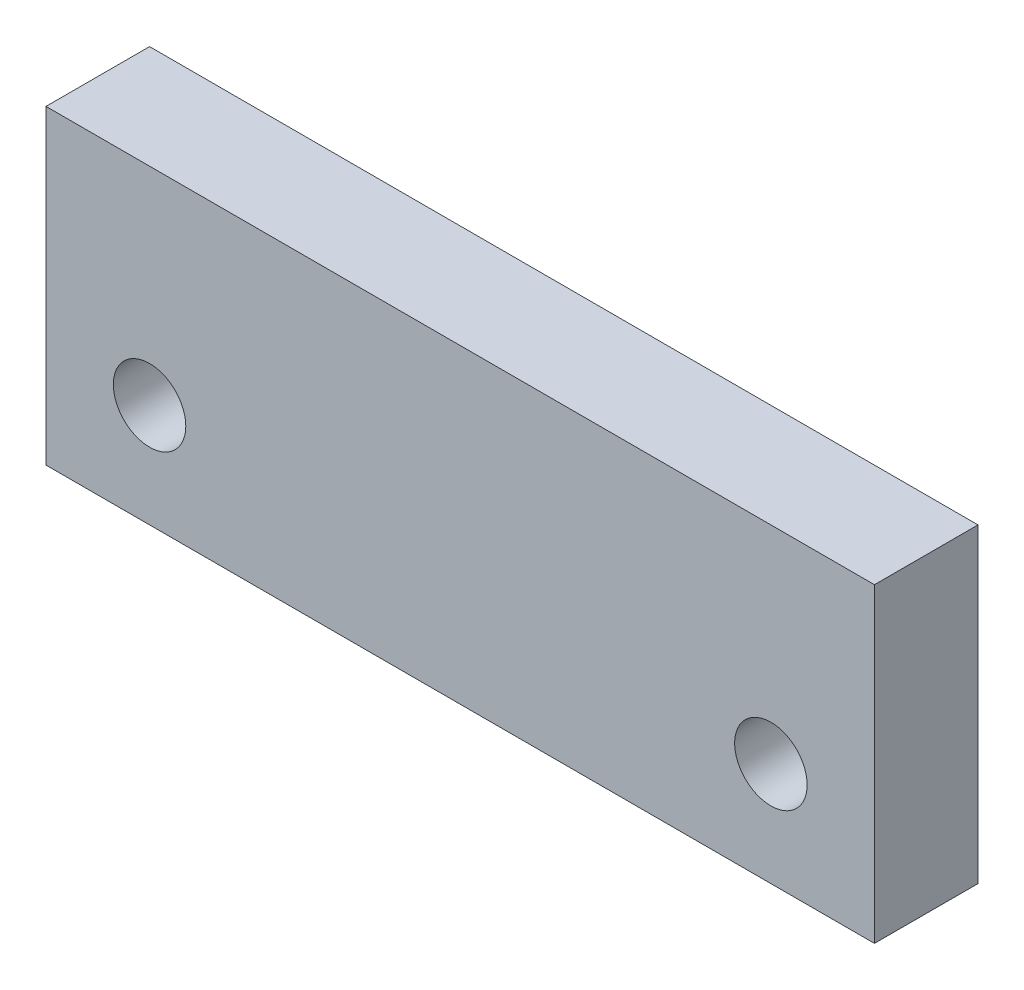
ISO-10303-21;
HEADER;
FILE_DESCRIPTION(('STEP AP214'),'2;1');
FILE_NAME('part.step','',(''),(''),'','','');
FILE_SCHEMA(('AUTOMOTIVE_DESIGN { 1 0 10303 214 1 1 1 1 }'));
ENDSEC;
DATA;
#1=APPLICATION_CONTEXT('core data for automotive mechanical design processes');
#2=APPLICATION_PROTOCOL_DEFINITION('international standard','automotive_design',2000,#1);
#3=PRODUCT_CONTEXT('',#1,'mechanical');
#4=PRODUCT('Part','Part','',(#3));
#5=PRODUCT_RELATED_PRODUCT_CATEGORY('part','',(#4));
#6=PRODUCT_DEFINITION_FORMATION('','',#4);
#7=PRODUCT_DEFINITION_CONTEXT('part definition',#1,'design');
#8=PRODUCT_DEFINITION('design','',#6,#7);
#9=PRODUCT_DEFINITION_SHAPE('','',#8);
#10=(LENGTH_UNIT() NAMED_UNIT(*) SI_UNIT(.MILLI.,.METRE.));
#11=(NAMED_UNIT(*) PLANE_ANGLE_UNIT() SI_UNIT($,.RADIAN.));
#12=(NAMED_UNIT(*) SI_UNIT($,.STERADIAN.) SOLID_ANGLE_UNIT());
#13=UNCERTAINTY_MEASURE_WITH_UNIT(LENGTH_MEASURE(1.E-05),#10,'distance_accuracy_value','');
#14=(GEOMETRIC_REPRESENTATION_CONTEXT(3) GLOBAL_UNCERTAINTY_ASSIGNED_CONTEXT((#13)) GLOBAL_UNIT_ASSIGNED_CONTEXT((#10,
#11,#12)) REPRESENTATION_CONTEXT('',''));
#15=CARTESIAN_POINT('',(0.,0.,0.));
#16=DIRECTION('',(0.,0.,1.));
#17=DIRECTION('',(1.,0.,0.));
#18=AXIS2_PLACEMENT_3D('',#15,#16,#17);
#19=CARTESIAN_POINT('',(0.,0.,5.));
#20=DIRECTION('',(0.,0.,-1.));
#21=DIRECTION('',(-1.,0.,0.));
#22=AXIS2_PLACEMENT_3D('',#19,#20,#21);
#23=PLANE('',#22);
#24=DIRECTION('',(0.,1.,0.));
#25=VECTOR('',#24,1.);
#26=CARTESIAN_POINT('',(20.,-7.5,5.));
#27=LINE('',#26,#25);
#28=CARTESIAN_POINT('',(20.,-7.5,5.));
#29=VERTEX_POINT('',#28);
#30=CARTESIAN_POINT('',(20.,7.5,5.));
#31=VERTEX_POINT('',#30);
#32=EDGE_CURVE('E93',#29,#31,#27,.T.);
#33=ORIENTED_EDGE('',*,*,#32,.T.);
#34=DIRECTION('',(-1.,0.,0.));
#35=VECTOR('',#34,1.);
#36=CARTESIAN_POINT('',(-20.,7.5,5.));
#37=LINE('',#36,#35);
#38=CARTESIAN_POINT('',(-20.,7.5,5.));
#39=VERTEX_POINT('',#38);
#40=EDGE_CURVE('E88',#31,#39,#37,.T.);
#41=ORIENTED_EDGE('',*,*,#40,.T.);
#42=DIRECTION('',(0.,-1.,0.));
#43=VECTOR('',#42,1.);
#44=CARTESIAN_POINT('',(-20.,-7.5,5.));
#45=LINE('',#44,#43);
#46=CARTESIAN_POINT('',(-20.,-7.5,5.));
#47=VERTEX_POINT('',#46);
#48=EDGE_CURVE('E91',#39,#47,#45,.T.);
#49=ORIENTED_EDGE('',*,*,#48,.T.);
#50=DIRECTION('',(1.,0.,0.));
#51=VECTOR('',#50,1.);
#52=CARTESIAN_POINT('',(-20.,-7.5,5.));
#53=LINE('',#52,#51);
#54=EDGE_CURVE('E58',#47,#29,#53,.T.);
#55=ORIENTED_EDGE('',*,*,#54,.T.);
#56=EDGE_LOOP('',(#33,#41,#49,#55));
#57=FACE_BOUND('',#56,.T.);
#58=CARTESIAN_POINT('',(-15.,-2.5,5.));
#59=DIRECTION('',(0.,0.,1.));
#60=DIRECTION('',(1.,0.,0.));
#61=AXIS2_PLACEMENT_3D('',#58,#59,#60);
#62=CIRCLE('',#61,1.75);
#63=CARTESIAN_POINT('',(-13.25,-2.5,5.));
#64=VERTEX_POINT('',#63);
#65=EDGE_CURVE('E108',#64,#64,#62,.T.);
#66=ORIENTED_EDGE('',*,*,#65,.F.);
#67=EDGE_LOOP('',(#66));
#68=FACE_BOUND('',#67,.T.);
#69=CARTESIAN_POINT('',(15.,-2.5,5.));
#70=DIRECTION('',(0.,0.,1.));
#71=DIRECTION('',(1.,0.,0.));
#72=AXIS2_PLACEMENT_3D('',#69,#70,#71);
#73=CIRCLE('',#72,1.75);
#74=CARTESIAN_POINT('',(16.75,-2.5,5.));
#75=VERTEX_POINT('',#74);
#76=EDGE_CURVE('E123',#75,#75,#73,.T.);
#77=ORIENTED_EDGE('',*,*,#76,.F.);
#78=EDGE_LOOP('',(#77));
#79=FACE_BOUND('',#78,.T.);
#80=ADVANCED_FACE('F41',(#57,#68,#79),#23,.F.);
#81=CARTESIAN_POINT('',(0.,0.,0.));
#82=DIRECTION('',(0.,0.,-1.));
#83=DIRECTION('',(-1.,0.,0.));
#84=AXIS2_PLACEMENT_3D('',#81,#82,#83);
#85=PLANE('',#84);
#86=CARTESIAN_POINT('',(-15.,-2.5,0.));
#87=DIRECTION('',(0.,0.,1.));
#88=DIRECTION('',(1.,0.,0.));
#89=AXIS2_PLACEMENT_3D('',#86,#87,#88);
#90=CIRCLE('',#89,1.75);
#91=CARTESIAN_POINT('',(-13.25,-2.5,0.));
#92=VERTEX_POINT('',#91);
#93=EDGE_CURVE('E120',#92,#92,#90,.T.);
#94=ORIENTED_EDGE('',*,*,#93,.T.);
#95=EDGE_LOOP('',(#94));
#96=FACE_BOUND('',#95,.T.);
#97=DIRECTION('',(0.,1.,0.));
#98=VECTOR('',#97,1.);
#99=CARTESIAN_POINT('',(20.,-7.5,0.));
#100=LINE('',#99,#98);
#101=CARTESIAN_POINT('',(20.,-7.5,0.));
#102=VERTEX_POINT('',#101);
#103=CARTESIAN_POINT('',(20.,7.5,0.));
#104=VERTEX_POINT('',#103);
#105=EDGE_CURVE('E105',#102,#104,#100,.T.);
#106=ORIENTED_EDGE('',*,*,#105,.F.);
#107=DIRECTION('',(1.,0.,0.));
#108=VECTOR('',#107,1.);
#109=CARTESIAN_POINT('',(-20.,-7.5,0.));
#110=LINE('',#109,#108);
#111=CARTESIAN_POINT('',(-20.,-7.5,0.));
#112=VERTEX_POINT('',#111);
#113=EDGE_CURVE('E81',#112,#102,#110,.T.);
#114=ORIENTED_EDGE('',*,*,#113,.F.);
#115=DIRECTION('',(0.,-1.,0.));
#116=VECTOR('',#115,1.);
#117=CARTESIAN_POINT('',(-20.,-7.5,0.));
#118=LINE('',#117,#116);
#119=CARTESIAN_POINT('',(-20.,7.5,0.));
#120=VERTEX_POINT('',#119);
#121=EDGE_CURVE('E75',#120,#112,#118,.T.);
#122=ORIENTED_EDGE('',*,*,#121,.F.);
#123=DIRECTION('',(-1.,0.,0.));
#124=VECTOR('',#123,1.);
#125=CARTESIAN_POINT('',(-20.,7.5,0.));
#126=LINE('',#125,#124);
#127=EDGE_CURVE('E97',#104,#120,#126,.T.);
#128=ORIENTED_EDGE('',*,*,#127,.F.);
#129=EDGE_LOOP('',(#106,#114,#122,#128));
#130=FACE_BOUND('',#129,.T.);
#131=CARTESIAN_POINT('',(15.,-2.5,0.));
#132=DIRECTION('',(0.,0.,1.));
#133=DIRECTION('',(1.,0.,0.));
#134=AXIS2_PLACEMENT_3D('',#131,#132,#133);
#135=CIRCLE('',#134,1.75);
#136=CARTESIAN_POINT('',(16.75,-2.5,0.));
#137=VERTEX_POINT('',#136);
#138=EDGE_CURVE('E126',#137,#137,#135,.T.);
#139=ORIENTED_EDGE('',*,*,#138,.T.);
#140=EDGE_LOOP('',(#139));
#141=FACE_BOUND('',#140,.T.);
#142=ADVANCED_FACE('F116',(#96,#130,#141),#85,.T.);
#143=CARTESIAN_POINT('',(20.,-7.5,5.));
#144=DIRECTION('',(-1.,0.,0.));
#145=DIRECTION('',(0.,0.,1.));
#146=AXIS2_PLACEMENT_3D('',#143,#144,#145);
#147=PLANE('',#146);
#148=ORIENTED_EDGE('',*,*,#105,.T.);
#149=DIRECTION('',(0.,0.,-1.));
#150=VECTOR('',#149,1.);
#151=CARTESIAN_POINT('',(20.,7.5,5.));
#152=LINE('',#151,#150);
#153=EDGE_CURVE('E11',#31,#104,#152,.T.);
#154=ORIENTED_EDGE('',*,*,#153,.F.);
#155=ORIENTED_EDGE('',*,*,#32,.F.);
#156=DIRECTION('',(0.,0.,-1.));
#157=VECTOR('',#156,1.);
#158=CARTESIAN_POINT('',(20.,-7.5,5.));
#159=LINE('',#158,#157);
#160=EDGE_CURVE('E101',#29,#102,#159,.T.);
#161=ORIENTED_EDGE('',*,*,#160,.T.);
#162=EDGE_LOOP('',(#148,#154,#155,#161));
#163=FACE_BOUND('',#162,.T.);
#164=ADVANCED_FACE('F43',(#163),#147,.F.);
#165=CARTESIAN_POINT('',(-20.,7.5,5.));
#166=DIRECTION('',(0.,-1.,0.));
#167=DIRECTION('',(0.,0.,-1.));
#168=AXIS2_PLACEMENT_3D('',#165,#166,#167);
#169=PLANE('',#168);
#170=ORIENTED_EDGE('',*,*,#127,.T.);
#171=DIRECTION('',(0.,0.,-1.));
#172=VECTOR('',#171,1.);
#173=CARTESIAN_POINT('',(-20.,7.5,5.));
#174=LINE('',#173,#172);
#175=EDGE_CURVE('E50',#39,#120,#174,.T.);
#176=ORIENTED_EDGE('',*,*,#175,.F.);
#177=ORIENTED_EDGE('',*,*,#40,.F.);
#178=ORIENTED_EDGE('',*,*,#153,.T.);
#179=EDGE_LOOP('',(#170,#176,#177,#178));
#180=FACE_BOUND('',#179,.T.);
#181=ADVANCED_FACE('F96',(#180),#169,.F.);
#182=CARTESIAN_POINT('',(-20.,-7.5,5.));
#183=DIRECTION('',(1.,0.,0.));
#184=DIRECTION('',(0.,0.,-1.));
#185=AXIS2_PLACEMENT_3D('',#182,#183,#184);
#186=PLANE('',#185);
#187=ORIENTED_EDGE('',*,*,#121,.T.);
#188=DIRECTION('',(0.,0.,-1.));
#189=VECTOR('',#188,1.);
#190=CARTESIAN_POINT('',(-20.,-7.5,5.));
#191=LINE('',#190,#189);
#192=EDGE_CURVE('E98',#47,#112,#191,.T.);
#193=ORIENTED_EDGE('',*,*,#192,.F.);
#194=ORIENTED_EDGE('',*,*,#48,.F.);
#195=ORIENTED_EDGE('',*,*,#175,.T.);
#196=EDGE_LOOP('',(#187,#193,#194,#195));
#197=FACE_BOUND('',#196,.T.);
#198=ADVANCED_FACE('F99',(#197),#186,.F.);
#199=CARTESIAN_POINT('',(-20.,-7.5,5.));
#200=DIRECTION('',(0.,1.,0.));
#201=DIRECTION('',(0.,0.,1.));
#202=AXIS2_PLACEMENT_3D('',#199,#200,#201);
#203=PLANE('',#202);
#204=ORIENTED_EDGE('',*,*,#113,.T.);
#205=ORIENTED_EDGE('',*,*,#160,.F.);
#206=ORIENTED_EDGE('',*,*,#54,.F.);
#207=ORIENTED_EDGE('',*,*,#192,.T.);
#208=EDGE_LOOP('',(#204,#205,#206,#207));
#209=FACE_BOUND('',#208,.T.);
#210=ADVANCED_FACE('F113',(#209),#203,.F.);
#211=CARTESIAN_POINT('',(-15.,-2.5,5.));
#212=DIRECTION('',(0.,0.,-1.));
#213=DIRECTION('',(-1.,0.,0.));
#214=AXIS2_PLACEMENT_3D('',#211,#212,#213);
#215=CYLINDRICAL_SURFACE('',#214,1.75);
#216=ORIENTED_EDGE('',*,*,#65,.T.);
#217=EDGE_LOOP('',(#216));
#218=FACE_BOUND('',#217,.T.);
#219=ORIENTED_EDGE('',*,*,#93,.F.);
#220=EDGE_LOOP('',(#219));
#221=FACE_BOUND('',#220,.T.);
#222=ADVANCED_FACE('F143',(#218,#221),#215,.F.);
#223=CARTESIAN_POINT('',(15.,-2.5,5.));
#224=DIRECTION('',(0.,0.,-1.));
#225=DIRECTION('',(-1.,0.,0.));
#226=AXIS2_PLACEMENT_3D('',#223,#224,#225);
#227=CYLINDRICAL_SURFACE('',#226,1.75);
#228=ORIENTED_EDGE('',*,*,#76,.T.);
#229=EDGE_LOOP('',(#228));
#230=FACE_BOUND('',#229,.T.);
#231=ORIENTED_EDGE('',*,*,#138,.F.);
#232=EDGE_LOOP('',(#231));
#233=FACE_BOUND('',#232,.T.);
#234=ADVANCED_FACE('F132',(#230,#233),#227,.F.);
#235=CLOSED_SHELL('',(#80,#142,#164,#181,#198,#210,#222,#234));
#236=MANIFOLD_SOLID_BREP('B2',#235);
#237=ADVANCED_BREP_SHAPE_REPRESENTATION('',(#18,#236),#14);
#238=SHAPE_DEFINITION_REPRESENTATION(#9,#237);
ENDSEC;
END-ISO-10303-21;
